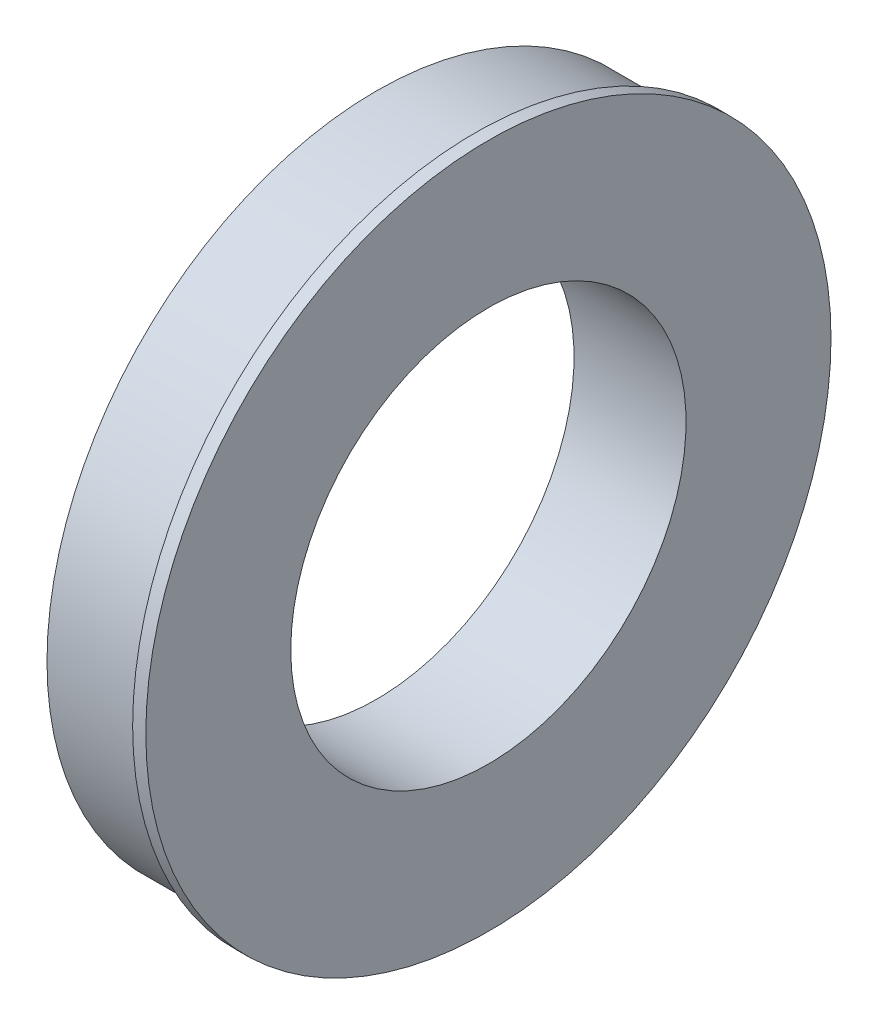
ISO-10303-21;
HEADER;
FILE_DESCRIPTION(('STEP AP214'),'2;1');
FILE_NAME('part.step','',(''),(''),'','','');
FILE_SCHEMA(('AUTOMOTIVE_DESIGN { 1 0 10303 214 1 1 1 1 }'));
ENDSEC;
DATA;
#1=APPLICATION_CONTEXT('core data for automotive mechanical design processes');
#2=APPLICATION_PROTOCOL_DEFINITION('international standard','automotive_design',2000,#1);
#3=PRODUCT_CONTEXT('',#1,'mechanical');
#4=PRODUCT('Part','Part','',(#3));
#5=PRODUCT_RELATED_PRODUCT_CATEGORY('part','',(#4));
#6=PRODUCT_DEFINITION_FORMATION('','',#4);
#7=PRODUCT_DEFINITION_CONTEXT('part definition',#1,'design');
#8=PRODUCT_DEFINITION('design','',#6,#7);
#9=PRODUCT_DEFINITION_SHAPE('','',#8);
#10=(LENGTH_UNIT() NAMED_UNIT(*) SI_UNIT(.MILLI.,.METRE.));
#11=(NAMED_UNIT(*) PLANE_ANGLE_UNIT() SI_UNIT($,.RADIAN.));
#12=(NAMED_UNIT(*) SI_UNIT($,.STERADIAN.) SOLID_ANGLE_UNIT());
#13=UNCERTAINTY_MEASURE_WITH_UNIT(LENGTH_MEASURE(1.E-05),#10,'distance_accuracy_value','');
#14=(GEOMETRIC_REPRESENTATION_CONTEXT(3) GLOBAL_UNCERTAINTY_ASSIGNED_CONTEXT((#13)) GLOBAL_UNIT_ASSIGNED_CONTEXT((#10,
#11,#12)) REPRESENTATION_CONTEXT('',''));
#15=CARTESIAN_POINT('',(0.,0.,0.));
#16=DIRECTION('',(0.,0.,1.));
#17=DIRECTION('',(1.,0.,0.));
#18=AXIS2_PLACEMENT_3D('',#15,#16,#17);
#19=CARTESIAN_POINT('',(9.71842437651609,0.,0.));
#20=DIRECTION('',(1.,0.,0.));
#21=DIRECTION('',(0.,0.,-1.));
#22=AXIS2_PLACEMENT_3D('',#19,#20,#21);
#23=PLANE('',#22);
#24=CARTESIAN_POINT('',(9.71842437651609,0.,0.));
#25=DIRECTION('',(1.,0.,0.));
#26=DIRECTION('',(0.,0.,-1.));
#27=AXIS2_PLACEMENT_3D('',#24,#25,#26);
#28=CIRCLE('',#27,7.068645639795);
#29=CARTESIAN_POINT('',(9.71842437651609,0.,7.068645639795));
#30=VERTEX_POINT('',#29);
#31=EDGE_CURVE('E40',#30,#30,#28,.T.);
#32=ORIENTED_EDGE('',*,*,#31,.F.);
#33=EDGE_LOOP('',(#32));
#34=FACE_BOUND('',#33,.T.);
#35=CARTESIAN_POINT('',(9.71842437651609,0.,0.));
#36=DIRECTION('',(1.,0.,0.));
#37=DIRECTION('',(0.,0.,-1.));
#38=AXIS2_PLACEMENT_3D('',#35,#36,#37);
#39=CIRCLE('',#38,4.241187383877);
#40=CARTESIAN_POINT('',(9.71842437651609,0.,4.241187383877));
#41=VERTEX_POINT('',#40);
#42=EDGE_CURVE('E47',#41,#41,#39,.T.);
#43=ORIENTED_EDGE('',*,*,#42,.T.);
#44=EDGE_LOOP('',(#43));
#45=FACE_BOUND('',#44,.T.);
#46=ADVANCED_FACE('F36',(#34,#45),#23,.F.);
#47=CARTESIAN_POINT('',(11.8390180684546,0.,0.));
#48=DIRECTION('',(-1.,0.,0.));
#49=DIRECTION('',(0.,0.,1.));
#50=AXIS2_PLACEMENT_3D('',#47,#48,#49);
#51=CYLINDRICAL_SURFACE('',#50,7.068645639795);
#52=CARTESIAN_POINT('',(11.8390180684546,0.,0.));
#53=DIRECTION('',(1.,0.,0.));
#54=DIRECTION('',(0.,0.,-1.));
#55=AXIS2_PLACEMENT_3D('',#52,#53,#54);
#56=CIRCLE('',#55,7.068645639795);
#57=CARTESIAN_POINT('',(11.8390180684546,0.,7.068645639795));
#58=VERTEX_POINT('',#57);
#59=EDGE_CURVE('E10',#58,#58,#56,.T.);
#60=CARTESIAN_POINT('',(11.8390180684546,0.,7.068645639795));
#61=CARTESIAN_POINT('',(11.8169285508302,0.,7.068645639795));
#62=CARTESIAN_POINT('',(11.7948390332059,0.,7.068645639795));
#63=CARTESIAN_POINT('',(11.7506599979572,0.,7.068645639795));
#64=CARTESIAN_POINT('',(11.7285704803328,0.,7.068645639795));
#65=CARTESIAN_POINT('',(11.6843914450841,0.,7.068645639795));
#66=CARTESIAN_POINT('',(11.6623019274597,0.,7.068645639795));
#67=CARTESIAN_POINT('',(11.618122892211,0.,7.068645639795));
#68=CARTESIAN_POINT('',(11.5960333745866,0.,7.068645639795));
#69=CARTESIAN_POINT('',(11.5518543393379,0.,7.068645639795));
#70=CARTESIAN_POINT('',(11.5297648217136,0.,7.068645639795));
#71=CARTESIAN_POINT('',(11.4855857864648,0.,7.068645639795));
#72=CARTESIAN_POINT('',(11.4634962688405,0.,7.068645639795));
#73=CARTESIAN_POINT('',(11.4193172335918,0.,7.068645639795));
#74=CARTESIAN_POINT('',(11.3972277159674,0.,7.068645639795));
#75=CARTESIAN_POINT('',(11.3530486807187,0.,7.068645639795));
#76=CARTESIAN_POINT('',(11.3309591630943,0.,7.068645639795));
#77=CARTESIAN_POINT('',(11.2867801278456,0.,7.068645639795));
#78=CARTESIAN_POINT('',(11.2646906102212,0.,7.068645639795));
#79=CARTESIAN_POINT('',(11.2205115749725,0.,7.068645639795));
#80=CARTESIAN_POINT('',(11.1984220573482,0.,7.068645639795));
#81=CARTESIAN_POINT('',(11.1542430220995,0.,7.068645639795));
#82=CARTESIAN_POINT('',(11.1321535044751,0.,7.068645639795));
#83=CARTESIAN_POINT('',(11.0879744692264,0.,7.068645639795));
#84=CARTESIAN_POINT('',(11.065884951602,0.,7.068645639795));
#85=CARTESIAN_POINT('',(11.0217059163533,0.,7.068645639795));
#86=CARTESIAN_POINT('',(10.9996163987289,0.,7.068645639795));
#87=CARTESIAN_POINT('',(10.9554373634802,0.,7.068645639795));
#88=CARTESIAN_POINT('',(10.9333478458559,0.,7.068645639795));
#89=CARTESIAN_POINT('',(10.8891688106071,0.,7.068645639795));
#90=CARTESIAN_POINT('',(10.8670792929828,0.,7.068645639795));
#91=CARTESIAN_POINT('',(10.8229002577341,0.,7.068645639795));
#92=CARTESIAN_POINT('',(10.8008107401097,0.,7.068645639795));
#93=CARTESIAN_POINT('',(10.756631704861,0.,7.068645639795));
#94=CARTESIAN_POINT('',(10.7345421872366,0.,7.068645639795));
#95=CARTESIAN_POINT('',(10.6903631519879,0.,7.068645639795));
#96=CARTESIAN_POINT('',(10.6682736343635,0.,7.068645639795));
#97=CARTESIAN_POINT('',(10.6240945991148,0.,7.068645639795));
#98=CARTESIAN_POINT('',(10.6020050814905,0.,7.068645639795));
#99=CARTESIAN_POINT('',(10.5578260462417,0.,7.068645639795));
#100=CARTESIAN_POINT('',(10.5357365286174,0.,7.068645639795));
#101=CARTESIAN_POINT('',(10.4915574933687,0.,7.068645639795));
#102=CARTESIAN_POINT('',(10.4694679757443,0.,7.068645639795));
#103=CARTESIAN_POINT('',(10.4252889404956,0.,7.068645639795));
#104=CARTESIAN_POINT('',(10.4031994228712,0.,7.068645639795));
#105=CARTESIAN_POINT('',(10.3590203876225,0.,7.068645639795));
#106=CARTESIAN_POINT('',(10.3369308699982,0.,7.068645639795));
#107=CARTESIAN_POINT('',(10.2927518347494,0.,7.068645639795));
#108=CARTESIAN_POINT('',(10.2706623171251,0.,7.068645639795));
#109=CARTESIAN_POINT('',(10.2264832818764,0.,7.068645639795));
#110=CARTESIAN_POINT('',(10.204393764252,0.,7.068645639795));
#111=CARTESIAN_POINT('',(10.1602147290033,0.,7.068645639795));
#112=CARTESIAN_POINT('',(10.1381252113789,0.,7.068645639795));
#113=CARTESIAN_POINT('',(10.0939461761302,0.,7.068645639795));
#114=CARTESIAN_POINT('',(10.0718566585058,0.,7.068645639795));
#115=CARTESIAN_POINT('',(10.0276776232571,0.,7.068645639795));
#116=CARTESIAN_POINT('',(10.0055881056328,0.,7.068645639795));
#117=CARTESIAN_POINT('',(9.96140907038405,0.,7.068645639795));
#118=CARTESIAN_POINT('',(9.93931955275969,0.,7.068645639795));
#119=CARTESIAN_POINT('',(9.89514051751097,0.,7.068645639795));
#120=CARTESIAN_POINT('',(9.87305099988661,0.,7.068645639795));
#121=CARTESIAN_POINT('',(9.82887196463789,0.,7.068645639795));
#122=CARTESIAN_POINT('',(9.80678244701353,0.,7.068645639795));
#123=CARTESIAN_POINT('',(9.76260341176481,0.,7.068645639795));
#124=CARTESIAN_POINT('',(9.74051389414045,0.,7.068645639795));
#125=CARTESIAN_POINT('',(9.71842437651609,0.,7.068645639795));
#126=B_SPLINE_CURVE_WITH_KNOTS('',3,(#60,#61,#62,#63,#64,#65,#66,#67,#68,#69,#70,#71,#72,#73,
#74,#75,#76,#77,#78,#79,#80,#81,#82,#83,#84,#85,#86,#87,#88,#89,#90,#91,#92,#93,#94,#95,#96,#97,
#98,#99,#100,#101,#102,#103,#104,#105,#106,#107,#108,#109,#110,#111,#112,#113,#114,#115,#116,
#117,#118,#119,#120,#121,#122,#123,#124,#125),.UNSPECIFIED.,.F.,.F.,(4,2,2,2,2,2,2,2,2,2,2,2,2,
2,2,2,2,2,2,2,2,2,2,2,2,2,2,2,2,2,2,2,4),(0.,0.0662685528730785,0.132537105746157,
0.198805658619235,0.265074211492314,0.331342764365392,0.397611317238469,0.463879870111547,
0.530148422984626,0.596416975857704,0.662685528730783,0.72895408160386,0.795222634476938,
0.861491187350016,0.927759740223095,0.994028293096173,1.06029684596925,1.12656539884233,
1.19283395171541,1.25910250458849,1.32537105746156,1.39163961033464,1.45790816320772,
1.5241767160808,1.59044526895388,1.65671382182695,1.72298237470003,1.78925092757311,
1.85551948044619,1.92178803331927,1.98805658619234,2.05432513906542,2.1205936919385),.UNSPECIFIED.);
#127=EDGE_CURVE('BSEAM38',#58,#30,#126,.T.);
#128=ORIENTED_EDGE('',*,*,#59,.F.);
#129=ORIENTED_EDGE('',*,*,#31,.T.);
#130=ORIENTED_EDGE('',*,*,#127,.T.);
#131=ORIENTED_EDGE('',*,*,#127,.F.);
#132=EDGE_LOOP('',(#128,#130,#129,#131));
#133=FACE_BOUND('',#132,.T.);
#134=ADVANCED_FACE('F38',(#133),#51,.T.);
#135=CARTESIAN_POINT('',(11.8390180684546,0.,0.));
#136=DIRECTION('',(-1.,0.,0.));
#137=DIRECTION('',(0.,0.,1.));
#138=AXIS2_PLACEMENT_3D('',#135,#136,#137);
#139=CYLINDRICAL_SURFACE('',#138,4.241187383877);
#140=CARTESIAN_POINT('',(12.1217638940464,0.,0.));
#141=DIRECTION('',(1.,0.,0.));
#142=DIRECTION('',(0.,0.,-1.));
#143=AXIS2_PLACEMENT_3D('',#140,#141,#142);
#144=CIRCLE('',#143,4.241187383877);
#145=CARTESIAN_POINT('',(12.1217638940464,0.,4.241187383877));
#146=VERTEX_POINT('',#145);
#147=EDGE_CURVE('E55',#146,#146,#144,.T.);
#148=CARTESIAN_POINT('',(9.71842437651609,0.,4.241187383877));
#149=CARTESIAN_POINT('',(9.74345916315703,0.,4.241187383877));
#150=CARTESIAN_POINT('',(9.76849394979798,0.,4.241187383877));
#151=CARTESIAN_POINT('',(9.81856352307986,0.,4.241187383877));
#152=CARTESIAN_POINT('',(9.8435983097208,0.,4.241187383877));
#153=CARTESIAN_POINT('',(9.89366788300268,0.,4.241187383877));
#154=CARTESIAN_POINT('',(9.91870266964362,0.,4.241187383877));
#155=CARTESIAN_POINT('',(9.9687722429255,0.,4.241187383877));
#156=CARTESIAN_POINT('',(9.99380702956644,0.,4.241187383877));
#157=CARTESIAN_POINT('',(10.0438766028483,0.,4.241187383877));
#158=CARTESIAN_POINT('',(10.0689113894893,0.,4.241187383877));
#159=CARTESIAN_POINT('',(10.1189809627711,0.,4.241187383877));
#160=CARTESIAN_POINT('',(10.1440157494121,0.,4.241187383877));
#161=CARTESIAN_POINT('',(10.194085322694,0.,4.241187383877));
#162=CARTESIAN_POINT('',(10.2191201093349,0.,4.241187383877));
#163=CARTESIAN_POINT('',(10.2691896826168,0.,4.241187383877));
#164=CARTESIAN_POINT('',(10.2942244692577,0.,4.241187383877));
#165=CARTESIAN_POINT('',(10.3442940425396,0.,4.241187383877));
#166=CARTESIAN_POINT('',(10.3693288291806,0.,4.241187383877));
#167=CARTESIAN_POINT('',(10.4193984024624,0.,4.241187383877));
#168=CARTESIAN_POINT('',(10.4444331891034,0.,4.241187383877));
#169=CARTESIAN_POINT('',(10.4945027623853,0.,4.241187383877));
#170=CARTESIAN_POINT('',(10.5195375490262,0.,4.241187383877));
#171=CARTESIAN_POINT('',(10.5696071223081,0.,4.241187383877));
#172=CARTESIAN_POINT('',(10.594641908949,0.,4.241187383877));
#173=CARTESIAN_POINT('',(10.6447114822309,0.,4.241187383877));
#174=CARTESIAN_POINT('',(10.6697462688718,0.,4.241187383877));
#175=CARTESIAN_POINT('',(10.7198158421537,0.,4.241187383877));
#176=CARTESIAN_POINT('',(10.7448506287947,0.,4.241187383877));
#177=CARTESIAN_POINT('',(10.7949202020765,0.,4.241187383877));
#178=CARTESIAN_POINT('',(10.8199549887175,0.,4.241187383877));
#179=CARTESIAN_POINT('',(10.8700245619994,0.,4.241187383877));
#180=CARTESIAN_POINT('',(10.8950593486403,0.,4.241187383877));
#181=CARTESIAN_POINT('',(10.9451289219222,0.,4.241187383877));
#182=CARTESIAN_POINT('',(10.9701637085631,0.,4.241187383877));
#183=CARTESIAN_POINT('',(11.020233281845,0.,4.241187383877));
#184=CARTESIAN_POINT('',(11.0452680684859,0.,4.241187383877));
#185=CARTESIAN_POINT('',(11.0953376417678,0.,4.241187383877));
#186=CARTESIAN_POINT('',(11.1203724284088,0.,4.241187383877));
#187=CARTESIAN_POINT('',(11.1704420016907,0.,4.241187383877));
#188=CARTESIAN_POINT('',(11.1954767883316,0.,4.241187383877));
#189=CARTESIAN_POINT('',(11.2455463616135,0.,4.241187383877));
#190=CARTESIAN_POINT('',(11.2705811482544,0.,4.241187383877));
#191=CARTESIAN_POINT('',(11.3206507215363,0.,4.241187383877));
#192=CARTESIAN_POINT('',(11.3456855081772,0.,4.241187383877));
#193=CARTESIAN_POINT('',(11.3957550814591,0.,4.241187383877));
#194=CARTESIAN_POINT('',(11.4207898681001,0.,4.241187383877));
#195=CARTESIAN_POINT('',(11.4708594413819,0.,4.241187383877));
#196=CARTESIAN_POINT('',(11.4958942280229,0.,4.241187383877));
#197=CARTESIAN_POINT('',(11.5459638013048,0.,4.241187383877));
#198=CARTESIAN_POINT('',(11.5709985879457,0.,4.241187383877));
#199=CARTESIAN_POINT('',(11.6210681612276,0.,4.241187383877));
#200=CARTESIAN_POINT('',(11.6461029478685,0.,4.241187383877));
#201=CARTESIAN_POINT('',(11.6961725211504,0.,4.241187383877));
#202=CARTESIAN_POINT('',(11.7212073077913,0.,4.241187383877));
#203=CARTESIAN_POINT('',(11.7712768810732,0.,4.241187383877));
#204=CARTESIAN_POINT('',(11.7963116677142,0.,4.241187383877));
#205=CARTESIAN_POINT('',(11.846381240996,0.,4.241187383877));
#206=CARTESIAN_POINT('',(11.871416027637,0.,4.241187383877));
#207=CARTESIAN_POINT('',(11.9214856009189,0.,4.241187383877));
#208=CARTESIAN_POINT('',(11.9465203875598,0.,4.241187383877));
#209=CARTESIAN_POINT('',(11.9965899608417,0.,4.241187383877));
#210=CARTESIAN_POINT('',(12.0216247474826,0.,4.241187383877));
#211=CARTESIAN_POINT('',(12.0716943207645,0.,4.241187383877));
#212=CARTESIAN_POINT('',(12.0967291074055,0.,4.241187383877));
#213=CARTESIAN_POINT('',(12.1217638940464,0.,4.241187383877));
#214=B_SPLINE_CURVE_WITH_KNOTS('',3,(#148,#149,#150,#151,#152,#153,#154,#155,#156,#157,#158,
#159,#160,#161,#162,#163,#164,#165,#166,#167,#168,#169,#170,#171,#172,#173,#174,#175,#176,#177,
#178,#179,#180,#181,#182,#183,#184,#185,#186,#187,#188,#189,#190,#191,#192,#193,#194,#195,#196,
#197,#198,#199,#200,#201,#202,#203,#204,#205,#206,#207,#208,#209,#210,#211,#212,#213),
.UNSPECIFIED.,.F.,.F.,(4,2,2,2,2,2,2,2,2,2,2,2,2,2,2,2,2,2,2,2,2,2,2,2,2,2,2,2,2,2,2,2,4),(0.,
0.0751043599228219,0.150208719845644,0.225313079768466,0.300417439691288,0.375521799614109,
0.450626159536931,0.525730519459753,0.600834879382575,0.675939239305397,0.751043599228219,
0.826147959151041,0.901252319073863,0.976356678996685,1.05146103891951,1.12656539884233,
1.20166975876515,1.27677411868797,1.35187847861079,1.42698283853362,1.50208719845644,
1.57719155837926,1.65229591830208,1.7274002782249,1.80250463814773,1.87760899807055,
1.95271335799337,2.02781771791619,2.10292207783901,2.17802643776183,2.25313079768466,
2.32823515760748,2.4033395175303),.UNSPECIFIED.);
#215=EDGE_CURVE('BSEAM61',#41,#146,#214,.T.);
#216=ORIENTED_EDGE('',*,*,#42,.F.);
#217=ORIENTED_EDGE('',*,*,#147,.T.);
#218=ORIENTED_EDGE('',*,*,#215,.T.);
#219=ORIENTED_EDGE('',*,*,#215,.F.);
#220=EDGE_LOOP('',(#216,#218,#217,#219));
#221=FACE_BOUND('',#220,.T.);
#222=ADVANCED_FACE('F61',(#221),#139,.F.);
#223=CARTESIAN_POINT('',(12.1217638940464,0.,0.));
#224=DIRECTION('',(1.,0.,0.));
#225=DIRECTION('',(0.,0.,-1.));
#226=AXIS2_PLACEMENT_3D('',#223,#224,#225);
#227=PLANE('',#226);
#228=CARTESIAN_POINT('',(12.1217638940464,0.,0.));
#229=DIRECTION('',(1.,0.,0.));
#230=DIRECTION('',(0.,0.,-1.));
#231=AXIS2_PLACEMENT_3D('',#228,#229,#230);
#232=CIRCLE('',#231,7.3513914653868);
#233=CARTESIAN_POINT('',(12.1217638940464,0.,-7.3513914653868));
#234=VERTEX_POINT('',#233);
#235=EDGE_CURVE('E51',#234,#234,#232,.T.);
#236=ORIENTED_EDGE('',*,*,#235,.T.);
#237=EDGE_LOOP('',(#236));
#238=FACE_BOUND('',#237,.T.);
#239=ORIENTED_EDGE('',*,*,#147,.F.);
#240=EDGE_LOOP('',(#239));
#241=FACE_BOUND('',#240,.T.);
#242=ADVANCED_FACE('F63',(#238,#241),#227,.T.);
#243=CARTESIAN_POINT('',(11.8390180684546,0.,0.));
#244=DIRECTION('',(1.,0.,0.));
#245=DIRECTION('',(0.,0.,-1.));
#246=AXIS2_PLACEMENT_3D('',#243,#244,#245);
#247=PLANE('',#246);
#248=ORIENTED_EDGE('',*,*,#59,.T.);
#249=EDGE_LOOP('',(#248));
#250=FACE_BOUND('',#249,.T.);
#251=CARTESIAN_POINT('',(11.8390180684546,0.,0.));
#252=DIRECTION('',(1.,0.,0.));
#253=DIRECTION('',(0.,0.,-1.));
#254=AXIS2_PLACEMENT_3D('',#251,#252,#253);
#255=CIRCLE('',#254,7.3513914653868);
#256=CARTESIAN_POINT('',(11.8390180684546,0.,-7.3513914653868));
#257=VERTEX_POINT('',#256);
#258=EDGE_CURVE('E52',#257,#257,#255,.T.);
#259=ORIENTED_EDGE('',*,*,#258,.F.);
#260=EDGE_LOOP('',(#259));
#261=FACE_BOUND('',#260,.T.);
#262=ADVANCED_FACE('F65',(#250,#261),#247,.F.);
#263=CARTESIAN_POINT('',(12.1217638940464,0.,0.));
#264=DIRECTION('',(-1.,0.,0.));
#265=DIRECTION('',(0.,0.,1.));
#266=AXIS2_PLACEMENT_3D('',#263,#264,#265);
#267=CYLINDRICAL_SURFACE('',#266,7.3513914653868);
#268=ORIENTED_EDGE('',*,*,#235,.F.);
#269=EDGE_LOOP('',(#268));
#270=FACE_BOUND('',#269,.T.);
#271=ORIENTED_EDGE('',*,*,#258,.T.);
#272=EDGE_LOOP('',(#271));
#273=FACE_BOUND('',#272,.T.);
#274=ADVANCED_FACE('F72',(#270,#273),#267,.T.);
#275=CLOSED_SHELL('',(#46,#134,#222,#242,#262,#274));
#276=MANIFOLD_SOLID_BREP('B2',#275);
#277=ADVANCED_BREP_SHAPE_REPRESENTATION('',(#18,#276),#14);
#278=SHAPE_DEFINITION_REPRESENTATION(#9,#277);
ENDSEC;
END-ISO-10303-21;
